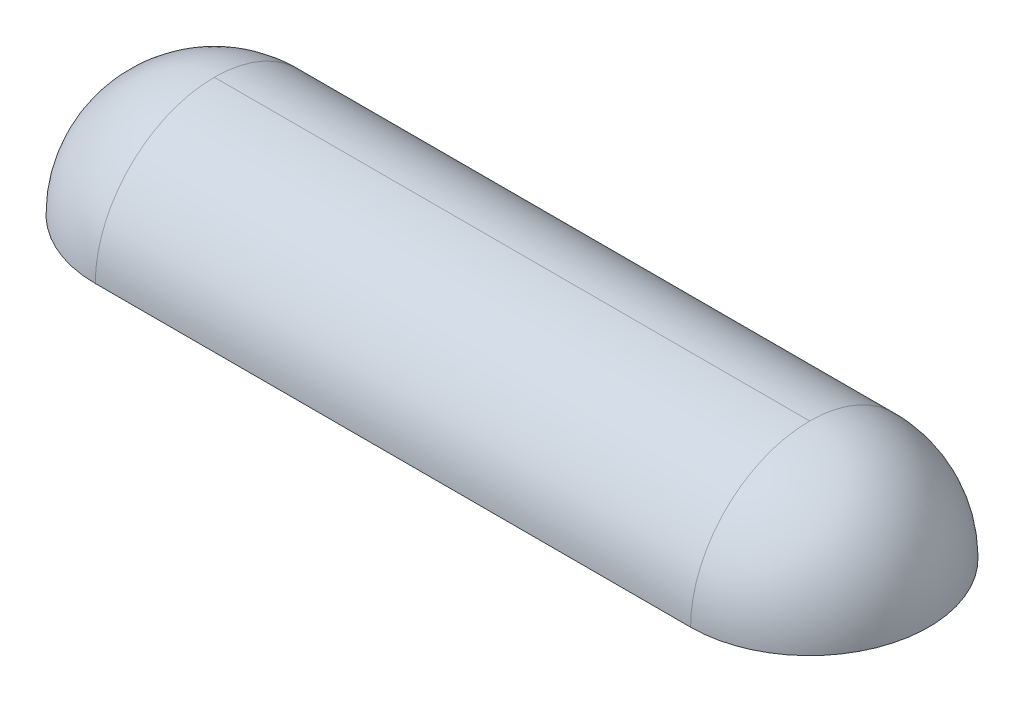
ISO-10303-21;
HEADER;
FILE_DESCRIPTION(('STEP AP214'),'2;1');
FILE_NAME('part.step','',(''),(''),'','','');
FILE_SCHEMA(('AUTOMOTIVE_DESIGN { 1 0 10303 214 1 1 1 1 }'));
ENDSEC;
DATA;
#1=APPLICATION_CONTEXT('core data for automotive mechanical design processes');
#2=APPLICATION_PROTOCOL_DEFINITION('international standard','automotive_design',2000,#1);
#3=PRODUCT_CONTEXT('',#1,'mechanical');
#4=PRODUCT('Part','Part','',(#3));
#5=PRODUCT_RELATED_PRODUCT_CATEGORY('part','',(#4));
#6=PRODUCT_DEFINITION_FORMATION('','',#4);
#7=PRODUCT_DEFINITION_CONTEXT('part definition',#1,'design');
#8=PRODUCT_DEFINITION('design','',#6,#7);
#9=PRODUCT_DEFINITION_SHAPE('','',#8);
#10=(LENGTH_UNIT() NAMED_UNIT(*) SI_UNIT(.MILLI.,.METRE.));
#11=(NAMED_UNIT(*) PLANE_ANGLE_UNIT() SI_UNIT($,.RADIAN.));
#12=(NAMED_UNIT(*) SI_UNIT($,.STERADIAN.) SOLID_ANGLE_UNIT());
#13=UNCERTAINTY_MEASURE_WITH_UNIT(LENGTH_MEASURE(1.E-05),#10,'distance_accuracy_value','');
#14=(GEOMETRIC_REPRESENTATION_CONTEXT(3) GLOBAL_UNCERTAINTY_ASSIGNED_CONTEXT((#13)) GLOBAL_UNIT_ASSIGNED_CONTEXT((#10,
#11,#12)) REPRESENTATION_CONTEXT('',''));
#15=CARTESIAN_POINT('',(0.,0.,0.));
#16=DIRECTION('',(0.,0.,1.));
#17=DIRECTION('',(1.,0.,0.));
#18=AXIS2_PLACEMENT_3D('',#15,#16,#17);
#19=CARTESIAN_POINT('',(-25.,0.,0.));
#20=DIRECTION('',(0.,1.,0.));
#21=DIRECTION('',(0.,0.,1.));
#22=AXIS2_PLACEMENT_3D('',#19,#20,#21);
#23=PLANE('',#22);
#24=DIRECTION('',(1.,0.,0.));
#25=VECTOR('',#24,1.);
#26=CARTESIAN_POINT('',(25.,0.,-9.50000000000001));
#27=LINE('',#26,#25);
#28=CARTESIAN_POINT('',(25.,0.,-9.50000000000001));
#29=VERTEX_POINT('',#28);
#30=CARTESIAN_POINT('',(-25.,0.,-9.5));
#31=VERTEX_POINT('',#30);
#32=EDGE_CURVE('E103',#29,#31,#27,.F.);
#33=ORIENTED_EDGE('',*,*,#32,.T.);
#34=CARTESIAN_POINT('',(-25.,0.,0.));
#35=DIRECTION('',(0.,1.,0.));
#36=DIRECTION('',(0.,0.,1.));
#37=AXIS2_PLACEMENT_3D('',#34,#35,#36);
#38=CIRCLE('',#37,9.5);
#39=CARTESIAN_POINT('',(-25.,0.,9.5));
#40=VERTEX_POINT('',#39);
#41=EDGE_CURVE('E106',#31,#40,#38,.T.);
#42=ORIENTED_EDGE('',*,*,#41,.T.);
#43=DIRECTION('',(-1.,0.,0.));
#44=VECTOR('',#43,1.);
#45=CARTESIAN_POINT('',(-25.,0.,9.5));
#46=LINE('',#45,#44);
#47=CARTESIAN_POINT('',(25.,0.,9.49999999999999));
#48=VERTEX_POINT('',#47);
#49=EDGE_CURVE('E122',#40,#48,#46,.F.);
#50=ORIENTED_EDGE('',*,*,#49,.T.);
#51=CARTESIAN_POINT('',(25.,0.,0.));
#52=DIRECTION('',(0.,1.,0.));
#53=DIRECTION('',(0.,0.,1.));
#54=AXIS2_PLACEMENT_3D('',#51,#52,#53);
#55=CIRCLE('',#54,9.5);
#56=EDGE_CURVE('E114',#48,#29,#55,.T.);
#57=ORIENTED_EDGE('',*,*,#56,.T.);
#58=EDGE_LOOP('',(#33,#42,#50,#57));
#59=FACE_BOUND('',#58,.T.);
#60=CARTESIAN_POINT('',(-25.,0.,0.));
#61=DIRECTION('',(0.,1.,0.));
#62=DIRECTION('',(0.,0.,1.));
#63=AXIS2_PLACEMENT_3D('',#60,#61,#62);
#64=CIRCLE('',#63,10.);
#65=CARTESIAN_POINT('',(-25.,0.,-10.));
#66=VERTEX_POINT('',#65);
#67=CARTESIAN_POINT('',(-25.,0.,10.));
#68=VERTEX_POINT('',#67);
#69=EDGE_CURVE('E128',#66,#68,#64,.T.);
#70=ORIENTED_EDGE('',*,*,#69,.F.);
#71=DIRECTION('',(-1.,0.,0.));
#72=VECTOR('',#71,1.);
#73=CARTESIAN_POINT('',(-25.,0.,-10.));
#74=LINE('',#73,#72);
#75=CARTESIAN_POINT('',(25.,0.,-10.));
#76=VERTEX_POINT('',#75);
#77=EDGE_CURVE('E11',#76,#66,#74,.T.);
#78=ORIENTED_EDGE('',*,*,#77,.F.);
#79=CARTESIAN_POINT('',(25.,0.,0.));
#80=DIRECTION('',(0.,1.,0.));
#81=DIRECTION('',(0.,0.,1.));
#82=AXIS2_PLACEMENT_3D('',#79,#80,#81);
#83=CIRCLE('',#82,10.);
#84=CARTESIAN_POINT('',(25.,0.,9.99999999999999));
#85=VERTEX_POINT('',#84);
#86=EDGE_CURVE('E42',#85,#76,#83,.T.);
#87=ORIENTED_EDGE('',*,*,#86,.F.);
#88=DIRECTION('',(1.,0.,0.));
#89=VECTOR('',#88,1.);
#90=CARTESIAN_POINT('',(-25.,0.,10.));
#91=LINE('',#90,#89);
#92=EDGE_CURVE('E82',#68,#85,#91,.T.);
#93=ORIENTED_EDGE('',*,*,#92,.F.);
#94=EDGE_LOOP('',(#70,#78,#87,#93));
#95=FACE_BOUND('',#94,.T.);
#96=ADVANCED_FACE('F33',(#59,#95),#23,.F.);
#97=CARTESIAN_POINT('',(25.,0.,0.));
#98=DIRECTION('',(0.,1.,0.));
#99=DIRECTION('',(0.,0.,1.));
#100=AXIS2_PLACEMENT_3D('',#97,#98,#99);
#101=SPHERICAL_SURFACE('',#100,10.);
#102=CARTESIAN_POINT('',(25.,0.,0.));
#103=DIRECTION('',(-1.,0.,0.));
#104=DIRECTION('',(0.,0.,1.));
#105=AXIS2_PLACEMENT_3D('',#102,#103,#104);
#106=CIRCLE('',#105,10.);
#107=CARTESIAN_POINT('',(25.,10.,0.));
#108=VERTEX_POINT('',#107);
#109=EDGE_CURVE('E134',#85,#108,#106,.T.);
#110=ORIENTED_EDGE('',*,*,#109,.F.);
#111=ORIENTED_EDGE('',*,*,#86,.T.);
#112=CARTESIAN_POINT('',(25.,0.,0.));
#113=DIRECTION('',(-1.,0.,0.));
#114=DIRECTION('',(0.,0.,1.));
#115=AXIS2_PLACEMENT_3D('',#112,#113,#114);
#116=CIRCLE('',#115,10.);
#117=EDGE_CURVE('E37',#108,#76,#116,.T.);
#118=ORIENTED_EDGE('',*,*,#117,.F.);
#119=EDGE_LOOP('',(#110,#111,#118));
#120=FACE_BOUND('',#119,.T.);
#121=ADVANCED_FACE('F35',(#120),#101,.T.);
#122=CARTESIAN_POINT('',(-25.,0.,0.));
#123=DIRECTION('',(1.,0.,0.));
#124=DIRECTION('',(0.,0.,-1.));
#125=AXIS2_PLACEMENT_3D('',#122,#123,#124);
#126=CYLINDRICAL_SURFACE('',#125,10.);
#127=DIRECTION('',(-1.,0.,0.));
#128=VECTOR('',#127,1.);
#129=CARTESIAN_POINT('',(-25.,10.,0.));
#130=LINE('',#129,#128);
#131=CARTESIAN_POINT('',(-25.,10.,0.));
#132=VERTEX_POINT('',#131);
#133=EDGE_CURVE('E136',#108,#132,#130,.T.);
#134=ORIENTED_EDGE('',*,*,#133,.F.);
#135=ORIENTED_EDGE('',*,*,#117,.T.);
#136=ORIENTED_EDGE('',*,*,#77,.T.);
#137=CARTESIAN_POINT('',(-25.,0.,0.));
#138=DIRECTION('',(-1.,0.,0.));
#139=DIRECTION('',(0.,0.,1.));
#140=AXIS2_PLACEMENT_3D('',#137,#138,#139);
#141=CIRCLE('',#140,10.);
#142=EDGE_CURVE('E59',#132,#66,#141,.T.);
#143=ORIENTED_EDGE('',*,*,#142,.F.);
#144=EDGE_LOOP('',(#134,#135,#136,#143));
#145=FACE_BOUND('',#144,.T.);
#146=ADVANCED_FACE('F140',(#145),#126,.T.);
#147=CARTESIAN_POINT('',(-25.,0.,0.));
#148=DIRECTION('',(-1.,0.,0.));
#149=DIRECTION('',(0.,0.,1.));
#150=AXIS2_PLACEMENT_3D('',#147,#148,#149);
#151=CYLINDRICAL_SURFACE('',#150,10.);
#152=ORIENTED_EDGE('',*,*,#109,.T.);
#153=ORIENTED_EDGE('',*,*,#133,.T.);
#154=CARTESIAN_POINT('',(-25.,0.,0.));
#155=DIRECTION('',(-1.,0.,0.));
#156=DIRECTION('',(0.,0.,1.));
#157=AXIS2_PLACEMENT_3D('',#154,#155,#156);
#158=CIRCLE('',#157,10.);
#159=EDGE_CURVE('E127',#68,#132,#158,.T.);
#160=ORIENTED_EDGE('',*,*,#159,.F.);
#161=ORIENTED_EDGE('',*,*,#92,.T.);
#162=EDGE_LOOP('',(#152,#153,#160,#161));
#163=FACE_BOUND('',#162,.T.);
#164=ADVANCED_FACE('F141',(#163),#151,.T.);
#165=CARTESIAN_POINT('',(-25.,0.,0.));
#166=DIRECTION('',(0.,1.,0.));
#167=DIRECTION('',(0.,0.,1.));
#168=AXIS2_PLACEMENT_3D('',#165,#166,#167);
#169=SPHERICAL_SURFACE('',#168,10.);
#170=ORIENTED_EDGE('',*,*,#142,.T.);
#171=ORIENTED_EDGE('',*,*,#69,.T.);
#172=ORIENTED_EDGE('',*,*,#159,.T.);
#173=EDGE_LOOP('',(#170,#171,#172));
#174=FACE_BOUND('',#173,.T.);
#175=ADVANCED_FACE('F142',(#174),#169,.T.);
#176=CARTESIAN_POINT('',(25.,0.,0.));
#177=DIRECTION('',(0.,1.,0.));
#178=DIRECTION('',(0.,0.,1.));
#179=AXIS2_PLACEMENT_3D('',#176,#177,#178);
#180=SPHERICAL_SURFACE('',#179,9.5);
#181=CARTESIAN_POINT('',(25.,0.,0.));
#182=DIRECTION('',(-1.,0.,0.));
#183=DIRECTION('',(0.,0.,1.));
#184=AXIS2_PLACEMENT_3D('',#181,#182,#183);
#185=CIRCLE('',#184,9.5);
#186=CARTESIAN_POINT('',(25.,9.5,0.));
#187=VERTEX_POINT('',#186);
#188=EDGE_CURVE('E50',#48,#187,#185,.T.);
#189=ORIENTED_EDGE('',*,*,#188,.T.);
#190=CARTESIAN_POINT('',(25.,0.,0.));
#191=DIRECTION('',(1.,0.,0.));
#192=DIRECTION('',(0.,0.,-1.));
#193=AXIS2_PLACEMENT_3D('',#190,#191,#192);
#194=CIRCLE('',#193,9.5);
#195=EDGE_CURVE('E98',#187,#29,#194,.F.);
#196=ORIENTED_EDGE('',*,*,#195,.T.);
#197=ORIENTED_EDGE('',*,*,#56,.F.);
#198=EDGE_LOOP('',(#189,#196,#197));
#199=FACE_BOUND('',#198,.T.);
#200=ADVANCED_FACE('F113',(#199),#180,.F.);
#201=CARTESIAN_POINT('',(-25.,0.,0.));
#202=DIRECTION('',(1.,0.,0.));
#203=DIRECTION('',(0.,0.,-1.));
#204=AXIS2_PLACEMENT_3D('',#201,#202,#203);
#205=CYLINDRICAL_SURFACE('',#204,9.5);
#206=DIRECTION('',(-1.,0.,0.));
#207=VECTOR('',#206,1.);
#208=CARTESIAN_POINT('',(-25.,9.5,0.));
#209=LINE('',#208,#207);
#210=CARTESIAN_POINT('',(-25.,9.5,0.));
#211=VERTEX_POINT('',#210);
#212=EDGE_CURVE('E100',#187,#211,#209,.T.);
#213=ORIENTED_EDGE('',*,*,#212,.T.);
#214=CARTESIAN_POINT('',(-25.,0.,0.));
#215=DIRECTION('',(1.,0.,0.));
#216=DIRECTION('',(0.,0.,-1.));
#217=AXIS2_PLACEMENT_3D('',#214,#215,#216);
#218=CIRCLE('',#217,9.5);
#219=EDGE_CURVE('E116',#211,#31,#218,.F.);
#220=ORIENTED_EDGE('',*,*,#219,.T.);
#221=ORIENTED_EDGE('',*,*,#32,.F.);
#222=ORIENTED_EDGE('',*,*,#195,.F.);
#223=EDGE_LOOP('',(#213,#220,#221,#222));
#224=FACE_BOUND('',#223,.T.);
#225=ADVANCED_FACE('F99',(#224),#205,.F.);
#226=CARTESIAN_POINT('',(-25.,0.,0.));
#227=DIRECTION('',(-1.,0.,0.));
#228=DIRECTION('',(0.,0.,1.));
#229=AXIS2_PLACEMENT_3D('',#226,#227,#228);
#230=CYLINDRICAL_SURFACE('',#229,9.5);
#231=ORIENTED_EDGE('',*,*,#188,.F.);
#232=ORIENTED_EDGE('',*,*,#49,.F.);
#233=CARTESIAN_POINT('',(-25.,0.,0.));
#234=DIRECTION('',(-1.,0.,0.));
#235=DIRECTION('',(0.,0.,1.));
#236=AXIS2_PLACEMENT_3D('',#233,#234,#235);
#237=CIRCLE('',#236,9.5);
#238=EDGE_CURVE('E111',#40,#211,#237,.T.);
#239=ORIENTED_EDGE('',*,*,#238,.T.);
#240=ORIENTED_EDGE('',*,*,#212,.F.);
#241=EDGE_LOOP('',(#231,#232,#239,#240));
#242=FACE_BOUND('',#241,.T.);
#243=ADVANCED_FACE('F109',(#242),#230,.F.);
#244=CARTESIAN_POINT('',(-25.,0.,0.));
#245=DIRECTION('',(0.,1.,0.));
#246=DIRECTION('',(0.,0.,1.));
#247=AXIS2_PLACEMENT_3D('',#244,#245,#246);
#248=SPHERICAL_SURFACE('',#247,9.5);
#249=ORIENTED_EDGE('',*,*,#219,.F.);
#250=ORIENTED_EDGE('',*,*,#238,.F.);
#251=ORIENTED_EDGE('',*,*,#41,.F.);
#252=EDGE_LOOP('',(#249,#250,#251));
#253=FACE_BOUND('',#252,.T.);
#254=ADVANCED_FACE('F158',(#253),#248,.F.);
#255=CLOSED_SHELL('',(#96,#121,#146,#164,#175,#200,#225,#243,#254));
#256=MANIFOLD_SOLID_BREP('B2',#255);
#257=ADVANCED_BREP_SHAPE_REPRESENTATION('',(#18,#256),#14);
#258=SHAPE_DEFINITION_REPRESENTATION(#9,#257);
ENDSEC;
END-ISO-10303-21;
